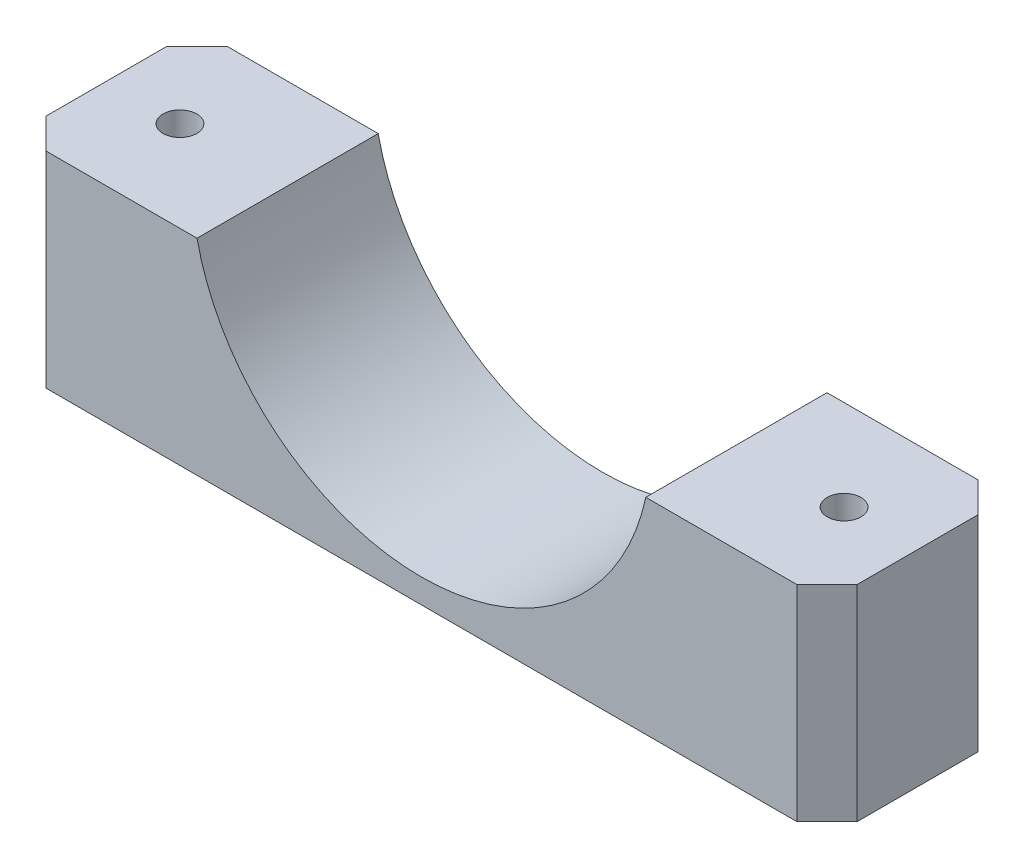
ISO-10303-21;
HEADER;
FILE_DESCRIPTION(('STEP AP214'),'2;1');
FILE_NAME('part.step','',(''),(''),'','','');
FILE_SCHEMA(('AUTOMOTIVE_DESIGN { 1 0 10303 214 1 1 1 1 }'));
ENDSEC;
DATA;
#1=APPLICATION_CONTEXT('core data for automotive mechanical design processes');
#2=APPLICATION_PROTOCOL_DEFINITION('international standard','automotive_design',2000,#1);
#3=PRODUCT_CONTEXT('',#1,'mechanical');
#4=PRODUCT('Part','Part','',(#3));
#5=PRODUCT_RELATED_PRODUCT_CATEGORY('part','',(#4));
#6=PRODUCT_DEFINITION_FORMATION('','',#4);
#7=PRODUCT_DEFINITION_CONTEXT('part definition',#1,'design');
#8=PRODUCT_DEFINITION('design','',#6,#7);
#9=PRODUCT_DEFINITION_SHAPE('','',#8);
#10=(LENGTH_UNIT() NAMED_UNIT(*) SI_UNIT(.MILLI.,.METRE.));
#11=(NAMED_UNIT(*) PLANE_ANGLE_UNIT() SI_UNIT($,.RADIAN.));
#12=(NAMED_UNIT(*) SI_UNIT($,.STERADIAN.) SOLID_ANGLE_UNIT());
#13=UNCERTAINTY_MEASURE_WITH_UNIT(LENGTH_MEASURE(1.E-05),#10,'distance_accuracy_value','');
#14=(GEOMETRIC_REPRESENTATION_CONTEXT(3) GLOBAL_UNCERTAINTY_ASSIGNED_CONTEXT((#13)) GLOBAL_UNIT_ASSIGNED_CONTEXT((#10,
#11,#12)) REPRESENTATION_CONTEXT('',''));
#15=CARTESIAN_POINT('',(0.,0.,0.));
#16=DIRECTION('',(0.,0.,1.));
#17=DIRECTION('',(1.,0.,0.));
#18=AXIS2_PLACEMENT_3D('',#15,#16,#17);
#19=CARTESIAN_POINT('',(33.5741756210067,-21.,15.));
#20=DIRECTION('',(-1.,0.,0.));
#21=DIRECTION('',(0.,0.,1.));
#22=AXIS2_PLACEMENT_3D('',#19,#20,#21);
#23=PLANE('',#22);
#24=DIRECTION('',(0.,0.,-1.));
#25=VECTOR('',#24,1.);
#26=CARTESIAN_POINT('',(33.5741756210067,-21.,15.));
#27=LINE('',#26,#25);
#28=CARTESIAN_POINT('',(33.5741756210067,-21.,12.5));
#29=VERTEX_POINT('',#28);
#30=CARTESIAN_POINT('',(33.5741756210067,-21.,2.50000000000002));
#31=VERTEX_POINT('',#30);
#32=EDGE_CURVE('E156',#29,#31,#27,.T.);
#33=ORIENTED_EDGE('',*,*,#32,.T.);
#34=DIRECTION('',(0.,1.,0.));
#35=VECTOR('',#34,1.);
#36=CARTESIAN_POINT('',(33.5741756210067,-21.,2.50000000000002));
#37=LINE('',#36,#35);
#38=CARTESIAN_POINT('',(33.5741756210067,-3.99999999999999,2.50000000000002));
#39=VERTEX_POINT('',#38);
#40=EDGE_CURVE('E176',#31,#39,#37,.T.);
#41=ORIENTED_EDGE('',*,*,#40,.T.);
#42=DIRECTION('',(0.,0.,-1.));
#43=VECTOR('',#42,1.);
#44=CARTESIAN_POINT('',(33.5741756210067,-3.99999999999999,15.));
#45=LINE('',#44,#43);
#46=CARTESIAN_POINT('',(33.5741756210067,-3.99999999999999,12.5));
#47=VERTEX_POINT('',#46);
#48=EDGE_CURVE('E144',#47,#39,#45,.T.);
#49=ORIENTED_EDGE('',*,*,#48,.F.);
#50=DIRECTION('',(0.,-1.,0.));
#51=VECTOR('',#50,1.);
#52=CARTESIAN_POINT('',(33.5741756210067,-21.,12.5));
#53=LINE('',#52,#51);
#54=EDGE_CURVE('E174',#47,#29,#53,.T.);
#55=ORIENTED_EDGE('',*,*,#54,.T.);
#56=EDGE_LOOP('',(#33,#41,#49,#55));
#57=FACE_BOUND('',#56,.T.);
#58=ADVANCED_FACE('F44',(#57),#23,.F.);
#59=CARTESIAN_POINT('',(33.5741756210067,-3.99999999999999,15.));
#60=DIRECTION('',(0.,-1.,0.));
#61=DIRECTION('',(1.,0.,0.));
#62=AXIS2_PLACEMENT_3D('',#59,#60,#61);
#63=PLANE('',#62);
#64=CARTESIAN_POINT('',(27.4886444805463,-4.,7.50000000000003));
#65=DIRECTION('',(0.,1.,0.));
#66=DIRECTION('',(-1.,0.,0.));
#67=AXIS2_PLACEMENT_3D('',#64,#65,#66);
#68=CIRCLE('',#67,1.4);
#69=CARTESIAN_POINT('',(26.0886444805463,-4.,7.50000000000003));
#70=VERTEX_POINT('',#69);
#71=EDGE_CURVE('E284',#70,#70,#68,.T.);
#72=ORIENTED_EDGE('',*,*,#71,.F.);
#73=EDGE_LOOP('',(#72));
#74=FACE_BOUND('',#73,.T.);
#75=ORIENTED_EDGE('',*,*,#48,.T.);
#76=DIRECTION('',(0.707106781186548,0.,0.707106781186547));
#77=VECTOR('',#76,1.);
#78=CARTESIAN_POINT('',(33.5741756210067,-3.99999999999999,2.50000000000001));
#79=LINE('',#78,#77);
#80=CARTESIAN_POINT('',(31.0741756210067,-4.,0.));
#81=VERTEX_POINT('',#80);
#82=EDGE_CURVE('E181',#39,#81,#79,.F.);
#83=ORIENTED_EDGE('',*,*,#82,.T.);
#84=DIRECTION('',(-1.,0.,0.));
#85=VECTOR('',#84,1.);
#86=CARTESIAN_POINT('',(33.5741756210067,-3.99999999999999,0.));
#87=LINE('',#86,#85);
#88=CARTESIAN_POINT('',(18.5741756210067,-4.,0.));
#89=VERTEX_POINT('',#88);
#90=EDGE_CURVE('E140',#81,#89,#87,.T.);
#91=ORIENTED_EDGE('',*,*,#90,.T.);
#92=DIRECTION('',(0.,0.,-1.));
#93=VECTOR('',#92,1.);
#94=CARTESIAN_POINT('',(18.5741756210067,-4.,15.));
#95=LINE('',#94,#93);
#96=CARTESIAN_POINT('',(18.5741756210067,-4.,15.));
#97=VERTEX_POINT('',#96);
#98=EDGE_CURVE('E136',#97,#89,#95,.T.);
#99=ORIENTED_EDGE('',*,*,#98,.F.);
#100=DIRECTION('',(-1.,0.,0.));
#101=VECTOR('',#100,1.);
#102=CARTESIAN_POINT('',(33.5741756210067,-3.99999999999999,15.));
#103=LINE('',#102,#101);
#104=CARTESIAN_POINT('',(31.0741756210067,-4.,15.));
#105=VERTEX_POINT('',#104);
#106=EDGE_CURVE('E123',#105,#97,#103,.T.);
#107=ORIENTED_EDGE('',*,*,#106,.F.);
#108=DIRECTION('',(0.707106781186548,0.,-0.707106781186548));
#109=VECTOR('',#108,1.);
#110=CARTESIAN_POINT('',(31.0741756210067,-4.,15.));
#111=LINE('',#110,#109);
#112=EDGE_CURVE('E179',#105,#47,#111,.T.);
#113=ORIENTED_EDGE('',*,*,#112,.T.);
#114=EDGE_LOOP('',(#75,#83,#91,#99,#107,#113));
#115=FACE_BOUND('',#114,.T.);
#116=ADVANCED_FACE('F138',(#74,#115),#63,.F.);
#117=CARTESIAN_POINT('',(0.,0.,15.));
#118=DIRECTION('',(0.,0.,-1.));
#119=DIRECTION('',(-1.,0.,0.));
#120=AXIS2_PLACEMENT_3D('',#117,#118,#119);
#121=CYLINDRICAL_SURFACE('',#120,19.);
#122=CARTESIAN_POINT('',(0.,0.,0.));
#123=DIRECTION('',(0.,0.,1.));
#124=DIRECTION('',(1.,0.,0.));
#125=AXIS2_PLACEMENT_3D('',#122,#123,#124);
#126=CIRCLE('',#125,19.);
#127=CARTESIAN_POINT('',(-18.5741756210067,-3.99999999999999,0.));
#128=VERTEX_POINT('',#127);
#129=EDGE_CURVE('E158',#128,#89,#126,.T.);
#130=ORIENTED_EDGE('',*,*,#129,.F.);
#131=DIRECTION('',(0.,0.,-1.));
#132=VECTOR('',#131,1.);
#133=CARTESIAN_POINT('',(-18.5741756210067,-3.99999999999999,15.));
#134=LINE('',#133,#132);
#135=CARTESIAN_POINT('',(-18.5741756210067,-3.99999999999999,15.));
#136=VERTEX_POINT('',#135);
#137=EDGE_CURVE('E145',#136,#128,#134,.T.);
#138=ORIENTED_EDGE('',*,*,#137,.F.);
#139=CARTESIAN_POINT('',(0.,0.,15.));
#140=DIRECTION('',(0.,0.,1.));
#141=DIRECTION('',(1.,0.,0.));
#142=AXIS2_PLACEMENT_3D('',#139,#140,#141);
#143=CIRCLE('',#142,19.);
#144=EDGE_CURVE('E129',#136,#97,#143,.T.);
#145=ORIENTED_EDGE('',*,*,#144,.T.);
#146=ORIENTED_EDGE('',*,*,#98,.T.);
#147=EDGE_LOOP('',(#130,#138,#145,#146));
#148=FACE_BOUND('',#147,.T.);
#149=ADVANCED_FACE('F147',(#148),#121,.F.);
#150=CARTESIAN_POINT('',(-18.5741756210067,-4.,15.));
#151=DIRECTION('',(0.,-1.,0.));
#152=DIRECTION('',(1.,0.,0.));
#153=AXIS2_PLACEMENT_3D('',#150,#151,#152);
#154=PLANE('',#153);
#155=CARTESIAN_POINT('',(-27.4886444805463,-4.00000000000002,7.50000000000003));
#156=DIRECTION('',(0.,1.,0.));
#157=DIRECTION('',(1.,0.,0.));
#158=AXIS2_PLACEMENT_3D('',#155,#156,#157);
#159=CIRCLE('',#158,1.4);
#160=CARTESIAN_POINT('',(-26.0886444805463,-4.00000000000002,7.50000000000003));
#161=VERTEX_POINT('',#160);
#162=EDGE_CURVE('E285',#161,#161,#159,.T.);
#163=ORIENTED_EDGE('',*,*,#162,.F.);
#164=EDGE_LOOP('',(#163));
#165=FACE_BOUND('',#164,.T.);
#166=DIRECTION('',(-1.,0.,0.));
#167=VECTOR('',#166,1.);
#168=CARTESIAN_POINT('',(-18.5741756210067,-4.,0.));
#169=LINE('',#168,#167);
#170=CARTESIAN_POINT('',(-31.0741756210067,-4.,0.));
#171=VERTEX_POINT('',#170);
#172=EDGE_CURVE('E161',#128,#171,#169,.T.);
#173=ORIENTED_EDGE('',*,*,#172,.T.);
#174=DIRECTION('',(0.707106781186548,0.,-0.707106781186547));
#175=VECTOR('',#174,1.);
#176=CARTESIAN_POINT('',(-33.5741756210067,-4.,2.50000000000002));
#177=LINE('',#176,#175);
#178=CARTESIAN_POINT('',(-33.5741756210067,-4.,2.50000000000002));
#179=VERTEX_POINT('',#178);
#180=EDGE_CURVE('E11',#171,#179,#177,.F.);
#181=ORIENTED_EDGE('',*,*,#180,.T.);
#182=DIRECTION('',(0.,0.,-1.));
#183=VECTOR('',#182,1.);
#184=CARTESIAN_POINT('',(-33.5741756210067,-4.,15.));
#185=LINE('',#184,#183);
#186=CARTESIAN_POINT('',(-33.5741756210067,-4.,12.5));
#187=VERTEX_POINT('',#186);
#188=EDGE_CURVE('E170',#187,#179,#185,.T.);
#189=ORIENTED_EDGE('',*,*,#188,.F.);
#190=DIRECTION('',(0.707106781186548,0.,0.707106781186548));
#191=VECTOR('',#190,1.);
#192=CARTESIAN_POINT('',(-31.0741756210067,-4.,15.));
#193=LINE('',#192,#191);
#194=CARTESIAN_POINT('',(-31.0741756210067,-4.,15.));
#195=VERTEX_POINT('',#194);
#196=EDGE_CURVE('E53',#187,#195,#193,.T.);
#197=ORIENTED_EDGE('',*,*,#196,.T.);
#198=DIRECTION('',(-1.,0.,0.));
#199=VECTOR('',#198,1.);
#200=CARTESIAN_POINT('',(-18.5741756210067,-4.,15.));
#201=LINE('',#200,#199);
#202=EDGE_CURVE('E149',#136,#195,#201,.T.);
#203=ORIENTED_EDGE('',*,*,#202,.F.);
#204=ORIENTED_EDGE('',*,*,#137,.T.);
#205=EDGE_LOOP('',(#173,#181,#189,#197,#203,#204));
#206=FACE_BOUND('',#205,.T.);
#207=ADVANCED_FACE('F203',(#165,#206),#154,.F.);
#208=CARTESIAN_POINT('',(-33.5741756210067,-4.,15.));
#209=DIRECTION('',(1.,0.,0.));
#210=DIRECTION('',(0.,0.,-1.));
#211=AXIS2_PLACEMENT_3D('',#208,#209,#210);
#212=PLANE('',#211);
#213=ORIENTED_EDGE('',*,*,#188,.T.);
#214=DIRECTION('',(0.,-1.,0.));
#215=VECTOR('',#214,1.);
#216=CARTESIAN_POINT('',(-33.5741756210067,-4.,2.50000000000002));
#217=LINE('',#216,#215);
#218=CARTESIAN_POINT('',(-33.5741756210067,-21.,2.50000000000002));
#219=VERTEX_POINT('',#218);
#220=EDGE_CURVE('E200',#179,#219,#217,.T.);
#221=ORIENTED_EDGE('',*,*,#220,.T.);
#222=DIRECTION('',(0.,0.,-1.));
#223=VECTOR('',#222,1.);
#224=CARTESIAN_POINT('',(-33.5741756210067,-21.,15.));
#225=LINE('',#224,#223);
#226=CARTESIAN_POINT('',(-33.5741756210067,-21.,12.5));
#227=VERTEX_POINT('',#226);
#228=EDGE_CURVE('E167',#227,#219,#225,.T.);
#229=ORIENTED_EDGE('',*,*,#228,.F.);
#230=DIRECTION('',(0.,1.,0.));
#231=VECTOR('',#230,1.);
#232=CARTESIAN_POINT('',(-33.5741756210067,-4.,12.5));
#233=LINE('',#232,#231);
#234=EDGE_CURVE('E65',#227,#187,#233,.T.);
#235=ORIENTED_EDGE('',*,*,#234,.T.);
#236=EDGE_LOOP('',(#213,#221,#229,#235));
#237=FACE_BOUND('',#236,.T.);
#238=ADVANCED_FACE('F209',(#237),#212,.F.);
#239=CARTESIAN_POINT('',(-33.5741756210067,-21.,15.));
#240=DIRECTION('',(0.,1.,0.));
#241=DIRECTION('',(0.,0.,1.));
#242=AXIS2_PLACEMENT_3D('',#239,#240,#241);
#243=PLANE('',#242);
#244=CARTESIAN_POINT('',(27.4886444805463,-21.,7.50000000000003));
#245=DIRECTION('',(0.,1.,0.));
#246=DIRECTION('',(-1.,0.,0.));
#247=AXIS2_PLACEMENT_3D('',#244,#245,#246);
#248=CIRCLE('',#247,1.4);
#249=CARTESIAN_POINT('',(26.0886444805463,-21.,7.50000000000003));
#250=VERTEX_POINT('',#249);
#251=EDGE_CURVE('E159',#250,#250,#248,.T.);
#252=ORIENTED_EDGE('',*,*,#251,.T.);
#253=EDGE_LOOP('',(#252));
#254=FACE_BOUND('',#253,.T.);
#255=CARTESIAN_POINT('',(-27.4886444805463,-21.,7.50000000000003));
#256=DIRECTION('',(0.,1.,0.));
#257=DIRECTION('',(1.,0.,0.));
#258=AXIS2_PLACEMENT_3D('',#255,#256,#257);
#259=CIRCLE('',#258,1.4);
#260=CARTESIAN_POINT('',(-26.0886444805463,-21.,7.50000000000003));
#261=VERTEX_POINT('',#260);
#262=EDGE_CURVE('E289',#261,#261,#259,.T.);
#263=ORIENTED_EDGE('',*,*,#262,.T.);
#264=EDGE_LOOP('',(#263));
#265=FACE_BOUND('',#264,.T.);
#266=DIRECTION('',(1.,0.,0.));
#267=VECTOR('',#266,1.);
#268=CARTESIAN_POINT('',(-33.5741756210067,-21.,0.));
#269=LINE('',#268,#267);
#270=CARTESIAN_POINT('',(-31.0741756210067,-21.,0.));
#271=VERTEX_POINT('',#270);
#272=CARTESIAN_POINT('',(31.0741756210067,-21.,0.));
#273=VERTEX_POINT('',#272);
#274=EDGE_CURVE('E133',#271,#273,#269,.T.);
#275=ORIENTED_EDGE('',*,*,#274,.T.);
#276=DIRECTION('',(-0.707106781186548,0.,-0.707106781186547));
#277=VECTOR('',#276,1.);
#278=CARTESIAN_POINT('',(33.5741756210067,-21.,2.50000000000002));
#279=LINE('',#278,#277);
#280=EDGE_CURVE('E193',#273,#31,#279,.F.);
#281=ORIENTED_EDGE('',*,*,#280,.T.);
#282=ORIENTED_EDGE('',*,*,#32,.F.);
#283=DIRECTION('',(-0.707106781186548,0.,0.707106781186548));
#284=VECTOR('',#283,1.);
#285=CARTESIAN_POINT('',(31.0741756210067,-21.,15.));
#286=LINE('',#285,#284);
#287=CARTESIAN_POINT('',(31.0741756210067,-21.,15.));
#288=VERTEX_POINT('',#287);
#289=EDGE_CURVE('E191',#29,#288,#286,.T.);
#290=ORIENTED_EDGE('',*,*,#289,.T.);
#291=DIRECTION('',(1.,0.,0.));
#292=VECTOR('',#291,1.);
#293=CARTESIAN_POINT('',(-33.5741756210067,-21.,15.));
#294=LINE('',#293,#292);
#295=CARTESIAN_POINT('',(-31.0741756210067,-21.,15.));
#296=VERTEX_POINT('',#295);
#297=EDGE_CURVE('E151',#296,#288,#294,.T.);
#298=ORIENTED_EDGE('',*,*,#297,.F.);
#299=DIRECTION('',(-0.707106781186548,0.,-0.707106781186548));
#300=VECTOR('',#299,1.);
#301=CARTESIAN_POINT('',(-31.0741756210067,-21.,15.));
#302=LINE('',#301,#300);
#303=EDGE_CURVE('E187',#296,#227,#302,.T.);
#304=ORIENTED_EDGE('',*,*,#303,.T.);
#305=ORIENTED_EDGE('',*,*,#228,.T.);
#306=DIRECTION('',(-0.707106781186548,0.,0.707106781186547));
#307=VECTOR('',#306,1.);
#308=CARTESIAN_POINT('',(-33.5741756210067,-21.,2.50000000000002));
#309=LINE('',#308,#307);
#310=EDGE_CURVE('E189',#219,#271,#309,.F.);
#311=ORIENTED_EDGE('',*,*,#310,.T.);
#312=EDGE_LOOP('',(#275,#281,#282,#290,#298,#304,#305,#311));
#313=FACE_BOUND('',#312,.T.);
#314=ADVANCED_FACE('F208',(#254,#265,#313),#243,.F.);
#315=CARTESIAN_POINT('',(0.,0.,15.));
#316=DIRECTION('',(0.,0.,1.));
#317=DIRECTION('',(1.,0.,0.));
#318=AXIS2_PLACEMENT_3D('',#315,#316,#317);
#319=PLANE('',#318);
#320=ORIENTED_EDGE('',*,*,#297,.T.);
#321=DIRECTION('',(0.,1.,0.));
#322=VECTOR('',#321,1.);
#323=CARTESIAN_POINT('',(31.0741756210067,-3.99999999999999,15.));
#324=LINE('',#323,#322);
#325=EDGE_CURVE('E131',#288,#105,#324,.T.);
#326=ORIENTED_EDGE('',*,*,#325,.T.);
#327=ORIENTED_EDGE('',*,*,#106,.T.);
#328=ORIENTED_EDGE('',*,*,#144,.F.);
#329=ORIENTED_EDGE('',*,*,#202,.T.);
#330=DIRECTION('',(0.,-1.,0.));
#331=VECTOR('',#330,1.);
#332=CARTESIAN_POINT('',(-31.0741756210067,-21.,15.));
#333=LINE('',#332,#331);
#334=EDGE_CURVE('E195',#195,#296,#333,.T.);
#335=ORIENTED_EDGE('',*,*,#334,.T.);
#336=EDGE_LOOP('',(#320,#326,#327,#328,#329,#335));
#337=FACE_BOUND('',#336,.T.);
#338=ADVANCED_FACE('F126',(#337),#319,.T.);
#339=CARTESIAN_POINT('',(0.,0.,0.));
#340=DIRECTION('',(0.,0.,1.));
#341=DIRECTION('',(1.,0.,0.));
#342=AXIS2_PLACEMENT_3D('',#339,#340,#341);
#343=PLANE('',#342);
#344=ORIENTED_EDGE('',*,*,#90,.F.);
#345=DIRECTION('',(0.,-1.,0.));
#346=VECTOR('',#345,1.);
#347=CARTESIAN_POINT('',(31.0741756210067,0.,0.));
#348=LINE('',#347,#346);
#349=EDGE_CURVE('E185',#81,#273,#348,.T.);
#350=ORIENTED_EDGE('',*,*,#349,.T.);
#351=ORIENTED_EDGE('',*,*,#274,.F.);
#352=DIRECTION('',(0.,1.,0.));
#353=VECTOR('',#352,1.);
#354=CARTESIAN_POINT('',(-31.0741756210067,0.,0.));
#355=LINE('',#354,#353);
#356=EDGE_CURVE('E183',#271,#171,#355,.T.);
#357=ORIENTED_EDGE('',*,*,#356,.T.);
#358=ORIENTED_EDGE('',*,*,#172,.F.);
#359=ORIENTED_EDGE('',*,*,#129,.T.);
#360=EDGE_LOOP('',(#344,#350,#351,#357,#358,#359));
#361=FACE_BOUND('',#360,.T.);
#362=ADVANCED_FACE('F217',(#361),#343,.F.);
#363=CARTESIAN_POINT('',(33.5741756210067,-21.,2.50000000000002));
#364=DIRECTION('',(-0.707106781186547,0.,0.707106781186548));
#365=DIRECTION('',(0.,1.,0.));
#366=AXIS2_PLACEMENT_3D('',#363,#364,#365);
#367=PLANE('',#366);
#368=ORIENTED_EDGE('',*,*,#280,.F.);
#369=ORIENTED_EDGE('',*,*,#349,.F.);
#370=ORIENTED_EDGE('',*,*,#82,.F.);
#371=ORIENTED_EDGE('',*,*,#40,.F.);
#372=EDGE_LOOP('',(#368,#369,#370,#371));
#373=FACE_BOUND('',#372,.T.);
#374=ADVANCED_FACE('F221',(#373),#367,.F.);
#375=CARTESIAN_POINT('',(31.0741756210067,0.,15.));
#376=DIRECTION('',(0.707106781186547,0.,0.707106781186547));
#377=DIRECTION('',(0.,-1.,0.));
#378=AXIS2_PLACEMENT_3D('',#375,#376,#377);
#379=PLANE('',#378);
#380=ORIENTED_EDGE('',*,*,#289,.F.);
#381=ORIENTED_EDGE('',*,*,#54,.F.);
#382=ORIENTED_EDGE('',*,*,#112,.F.);
#383=ORIENTED_EDGE('',*,*,#325,.F.);
#384=EDGE_LOOP('',(#380,#381,#382,#383));
#385=FACE_BOUND('',#384,.T.);
#386=ADVANCED_FACE('F229',(#385),#379,.T.);
#387=CARTESIAN_POINT('',(-33.5741756210067,-4.,2.50000000000002));
#388=DIRECTION('',(0.707106781186547,0.,0.707106781186548));
#389=DIRECTION('',(0.,-1.,0.));
#390=AXIS2_PLACEMENT_3D('',#387,#388,#389);
#391=PLANE('',#390);
#392=ORIENTED_EDGE('',*,*,#180,.F.);
#393=ORIENTED_EDGE('',*,*,#356,.F.);
#394=ORIENTED_EDGE('',*,*,#310,.F.);
#395=ORIENTED_EDGE('',*,*,#220,.F.);
#396=EDGE_LOOP('',(#392,#393,#394,#395));
#397=FACE_BOUND('',#396,.T.);
#398=ADVANCED_FACE('F212',(#397),#391,.F.);
#399=CARTESIAN_POINT('',(-31.0741756210067,0.,15.));
#400=DIRECTION('',(-0.707106781186547,0.,0.707106781186547));
#401=DIRECTION('',(0.,1.,0.));
#402=AXIS2_PLACEMENT_3D('',#399,#400,#401);
#403=PLANE('',#402);
#404=ORIENTED_EDGE('',*,*,#196,.F.);
#405=ORIENTED_EDGE('',*,*,#234,.F.);
#406=ORIENTED_EDGE('',*,*,#303,.F.);
#407=ORIENTED_EDGE('',*,*,#334,.F.);
#408=EDGE_LOOP('',(#404,#405,#406,#407));
#409=FACE_BOUND('',#408,.T.);
#410=ADVANCED_FACE('F47',(#409),#403,.T.);
#411=CARTESIAN_POINT('',(-27.4886444805463,-21.,7.50000000000003));
#412=DIRECTION('',(0.,1.,0.));
#413=DIRECTION('',(-1.,0.,0.));
#414=AXIS2_PLACEMENT_3D('',#411,#412,#413);
#415=CYLINDRICAL_SURFACE('',#414,1.4);
#416=ORIENTED_EDGE('',*,*,#262,.F.);
#417=EDGE_LOOP('',(#416));
#418=FACE_BOUND('',#417,.T.);
#419=ORIENTED_EDGE('',*,*,#162,.T.);
#420=EDGE_LOOP('',(#419));
#421=FACE_BOUND('',#420,.T.);
#422=ADVANCED_FACE('F270',(#418,#421),#415,.F.);
#423=CARTESIAN_POINT('',(27.4886444805463,-21.,7.50000000000003));
#424=DIRECTION('',(0.,1.,0.));
#425=DIRECTION('',(-1.,0.,0.));
#426=AXIS2_PLACEMENT_3D('',#423,#424,#425);
#427=CYLINDRICAL_SURFACE('',#426,1.4);
#428=ORIENTED_EDGE('',*,*,#251,.F.);
#429=EDGE_LOOP('',(#428));
#430=FACE_BOUND('',#429,.T.);
#431=ORIENTED_EDGE('',*,*,#71,.T.);
#432=EDGE_LOOP('',(#431));
#433=FACE_BOUND('',#432,.T.);
#434=ADVANCED_FACE('F273',(#430,#433),#427,.F.);
#435=CLOSED_SHELL('',(#58,#116,#149,#207,#238,#314,#338,#362,#374,#386,#398,#410,#422,#434));
#436=MANIFOLD_SOLID_BREP('B2',#435);
#437=ADVANCED_BREP_SHAPE_REPRESENTATION('',(#18,#436),#14);
#438=SHAPE_DEFINITION_REPRESENTATION(#9,#437);
ENDSEC;
END-ISO-10303-21;
